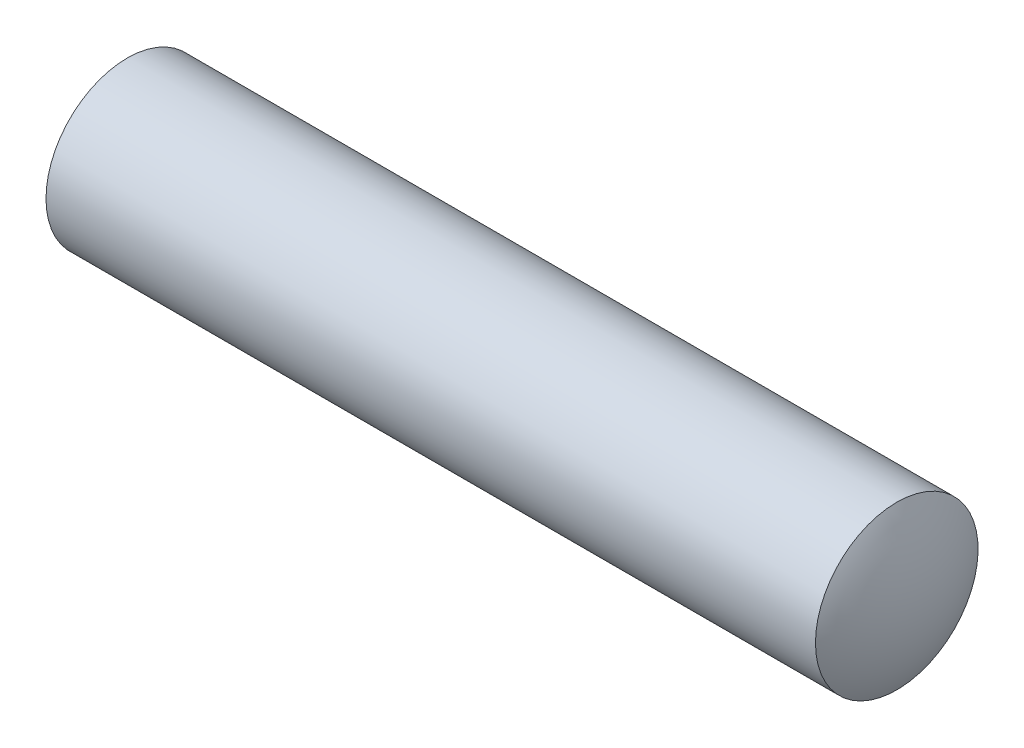
ISO-10303-21;
HEADER;
FILE_DESCRIPTION(('STEP AP214'),'2;1');
FILE_NAME('part.step','',(''),(''),'','','');
FILE_SCHEMA(('AUTOMOTIVE_DESIGN { 1 0 10303 214 1 1 1 1 }'));
ENDSEC;
DATA;
#1=APPLICATION_CONTEXT('core data for automotive mechanical design processes');
#2=APPLICATION_PROTOCOL_DEFINITION('international standard','automotive_design',2000,#1);
#3=PRODUCT_CONTEXT('',#1,'mechanical');
#4=PRODUCT('Part','Part','',(#3));
#5=PRODUCT_RELATED_PRODUCT_CATEGORY('part','',(#4));
#6=PRODUCT_DEFINITION_FORMATION('','',#4);
#7=PRODUCT_DEFINITION_CONTEXT('part definition',#1,'design');
#8=PRODUCT_DEFINITION('design','',#6,#7);
#9=PRODUCT_DEFINITION_SHAPE('','',#8);
#10=(LENGTH_UNIT() NAMED_UNIT(*) SI_UNIT(.MILLI.,.METRE.));
#11=(NAMED_UNIT(*) PLANE_ANGLE_UNIT() SI_UNIT($,.RADIAN.));
#12=(NAMED_UNIT(*) SI_UNIT($,.STERADIAN.) SOLID_ANGLE_UNIT());
#13=UNCERTAINTY_MEASURE_WITH_UNIT(LENGTH_MEASURE(1.E-05),#10,'distance_accuracy_value','');
#14=(GEOMETRIC_REPRESENTATION_CONTEXT(3) GLOBAL_UNCERTAINTY_ASSIGNED_CONTEXT((#13)) GLOBAL_UNIT_ASSIGNED_CONTEXT((#10,
#11,#12)) REPRESENTATION_CONTEXT('',''));
#15=CARTESIAN_POINT('',(0.,0.,0.));
#16=DIRECTION('',(0.,0.,1.));
#17=DIRECTION('',(1.,0.,0.));
#18=AXIS2_PLACEMENT_3D('',#15,#16,#17);
#19=CARTESIAN_POINT('',(3.,11.5,0.));
#20=DIRECTION('',(-1.,0.,0.));
#21=DIRECTION('',(0.,1.,0.));
#22=AXIS2_PLACEMENT_3D('',#19,#20,#21);
#23=SPHERICAL_SURFACE('',#22,3.);
#24=CARTESIAN_POINT('',(0.401923788646685,11.5,0.));
#25=DIRECTION('',(-1.,0.,0.));
#26=DIRECTION('',(0.,0.,1.));
#27=AXIS2_PLACEMENT_3D('',#24,#25,#26);
#28=CIRCLE('',#27,1.5);
#29=CARTESIAN_POINT('',(0.401923788646685,11.5,1.5));
#30=VERTEX_POINT('',#29);
#31=EDGE_CURVE('E35',#30,#30,#28,.T.);
#32=ORIENTED_EDGE('',*,*,#31,.T.);
#33=EDGE_LOOP('',(#32));
#34=FACE_BOUND('',#33,.T.);
#35=ADVANCED_FACE('F29',(#34),#23,.T.);
#36=CARTESIAN_POINT('',(12.,11.5,0.));
#37=DIRECTION('',(-1.,0.,0.));
#38=DIRECTION('',(0.,1.,0.));
#39=AXIS2_PLACEMENT_3D('',#36,#37,#38);
#40=SPHERICAL_SURFACE('',#39,3.);
#41=CARTESIAN_POINT('',(14.5980762113533,11.5,0.));
#42=DIRECTION('',(-1.,0.,0.));
#43=DIRECTION('',(0.,0.,1.));
#44=AXIS2_PLACEMENT_3D('',#41,#42,#43);
#45=CIRCLE('',#44,1.5);
#46=CARTESIAN_POINT('',(14.5980762113533,11.5,1.5));
#47=VERTEX_POINT('',#46);
#48=EDGE_CURVE('E10',#47,#47,#45,.T.);
#49=ORIENTED_EDGE('',*,*,#48,.F.);
#50=EDGE_LOOP('',(#49));
#51=FACE_BOUND('',#50,.T.);
#52=ADVANCED_FACE('F44',(#51),#40,.T.);
#53=CARTESIAN_POINT('',(-30.,11.5,0.));
#54=DIRECTION('',(-1.,0.,0.));
#55=DIRECTION('',(0.,0.,1.));
#56=AXIS2_PLACEMENT_3D('',#53,#54,#55);
#57=CYLINDRICAL_SURFACE('',#56,1.5);
#58=ORIENTED_EDGE('',*,*,#31,.F.);
#59=EDGE_LOOP('',(#58));
#60=FACE_BOUND('',#59,.T.);
#61=ORIENTED_EDGE('',*,*,#48,.T.);
#62=EDGE_LOOP('',(#61));
#63=FACE_BOUND('',#62,.T.);
#64=ADVANCED_FACE('F42',(#60,#63),#57,.T.);
#65=CLOSED_SHELL('',(#35,#52,#64));
#66=MANIFOLD_SOLID_BREP('B2',#65);
#67=ADVANCED_BREP_SHAPE_REPRESENTATION('',(#18,#66),#14);
#68=SHAPE_DEFINITION_REPRESENTATION(#9,#67);
ENDSEC;
END-ISO-10303-21;
